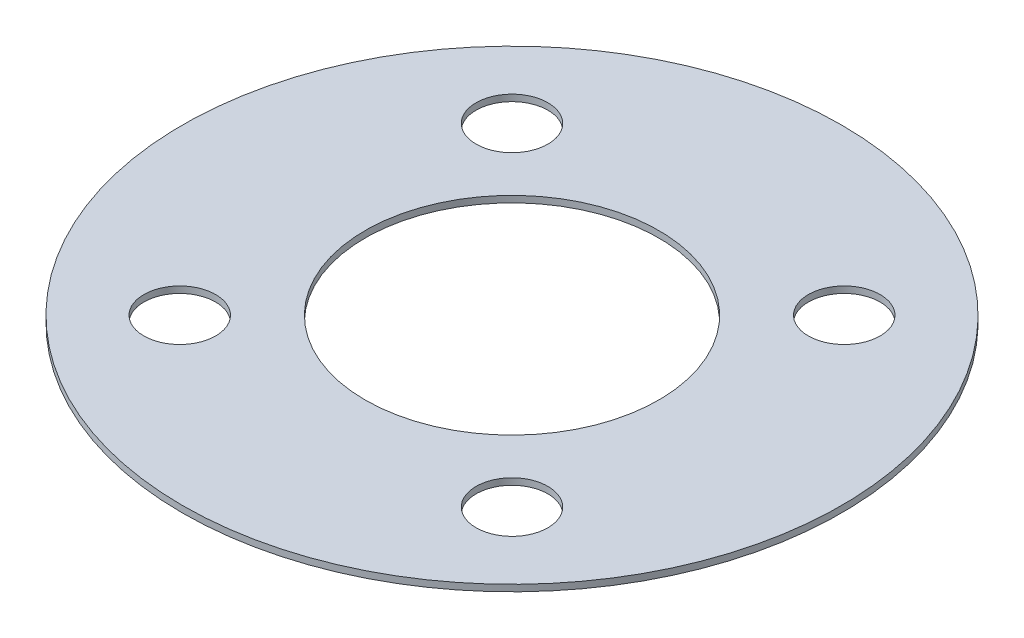
ISO-10303-21;
HEADER;
FILE_DESCRIPTION(('STEP AP214'),'2;1');
FILE_NAME('part.step','',(''),(''),'','','');
FILE_SCHEMA(('AUTOMOTIVE_DESIGN { 1 0 10303 214 1 1 1 1 }'));
ENDSEC;
DATA;
#1=APPLICATION_CONTEXT('core data for automotive mechanical design processes');
#2=APPLICATION_PROTOCOL_DEFINITION('international standard','automotive_design',2000,#1);
#3=PRODUCT_CONTEXT('',#1,'mechanical');
#4=PRODUCT('Part','Part','',(#3));
#5=PRODUCT_RELATED_PRODUCT_CATEGORY('part','',(#4));
#6=PRODUCT_DEFINITION_FORMATION('','',#4);
#7=PRODUCT_DEFINITION_CONTEXT('part definition',#1,'design');
#8=PRODUCT_DEFINITION('design','',#6,#7);
#9=PRODUCT_DEFINITION_SHAPE('','',#8);
#10=(LENGTH_UNIT() NAMED_UNIT(*) SI_UNIT(.MILLI.,.METRE.));
#11=(NAMED_UNIT(*) PLANE_ANGLE_UNIT() SI_UNIT($,.RADIAN.));
#12=(NAMED_UNIT(*) SI_UNIT($,.STERADIAN.) SOLID_ANGLE_UNIT());
#13=UNCERTAINTY_MEASURE_WITH_UNIT(LENGTH_MEASURE(1.E-05),#10,'distance_accuracy_value','');
#14=(GEOMETRIC_REPRESENTATION_CONTEXT(3) GLOBAL_UNCERTAINTY_ASSIGNED_CONTEXT((#13)) GLOBAL_UNIT_ASSIGNED_CONTEXT((#10,
#11,#12)) REPRESENTATION_CONTEXT('',''));
#15=CARTESIAN_POINT('',(0.,0.,0.));
#16=DIRECTION('',(0.,0.,1.));
#17=DIRECTION('',(1.,0.,0.));
#18=AXIS2_PLACEMENT_3D('',#15,#16,#17);
#19=CARTESIAN_POINT('',(0.,0.5,0.));
#20=DIRECTION('',(0.,-1.,0.));
#21=DIRECTION('',(0.,0.,-1.));
#22=AXIS2_PLACEMENT_3D('',#19,#20,#21);
#23=CYLINDRICAL_SURFACE('',#22,25.25);
#24=CARTESIAN_POINT('',(0.,0.5,0.));
#25=DIRECTION('',(0.,1.,0.));
#26=DIRECTION('',(0.,0.,1.));
#27=AXIS2_PLACEMENT_3D('',#24,#25,#26);
#28=CIRCLE('',#27,25.25);
#29=CARTESIAN_POINT('',(0.,0.5,25.25));
#30=VERTEX_POINT('',#29);
#31=EDGE_CURVE('E10',#30,#30,#28,.T.);
#32=ORIENTED_EDGE('',*,*,#31,.F.);
#33=EDGE_LOOP('',(#32));
#34=FACE_BOUND('',#33,.T.);
#35=CARTESIAN_POINT('',(0.,0.,0.));
#36=DIRECTION('',(0.,1.,0.));
#37=DIRECTION('',(0.,0.,1.));
#38=AXIS2_PLACEMENT_3D('',#35,#36,#37);
#39=CIRCLE('',#38,25.25);
#40=CARTESIAN_POINT('',(0.,0.,25.25));
#41=VERTEX_POINT('',#40);
#42=EDGE_CURVE('E41',#41,#41,#39,.T.);
#43=ORIENTED_EDGE('',*,*,#42,.T.);
#44=EDGE_LOOP('',(#43));
#45=FACE_BOUND('',#44,.T.);
#46=ADVANCED_FACE('F38',(#34,#45),#23,.T.);
#47=CARTESIAN_POINT('',(0.,0.5,0.));
#48=DIRECTION('',(0.,1.,0.));
#49=DIRECTION('',(0.,0.,1.));
#50=AXIS2_PLACEMENT_3D('',#47,#48,#49);
#51=PLANE('',#50);
#52=CARTESIAN_POINT('',(-12.7279220613579,0.5,-12.7279220613579));
#53=DIRECTION('',(0.,1.,0.));
#54=DIRECTION('',(0.,0.,1.));
#55=AXIS2_PLACEMENT_3D('',#52,#53,#54);
#56=CIRCLE('',#55,2.75);
#57=CARTESIAN_POINT('',(-12.7279220613579,0.5,-9.97792206135786));
#58=VERTEX_POINT('',#57);
#59=EDGE_CURVE('E76',#58,#58,#56,.T.);
#60=ORIENTED_EDGE('',*,*,#59,.F.);
#61=EDGE_LOOP('',(#60));
#62=FACE_BOUND('',#61,.T.);
#63=CARTESIAN_POINT('',(12.7279220613579,0.5,12.7279220613579));
#64=DIRECTION('',(0.,1.,0.));
#65=DIRECTION('',(0.,0.,1.));
#66=AXIS2_PLACEMENT_3D('',#63,#64,#65);
#67=CIRCLE('',#66,2.75);
#68=CARTESIAN_POINT('',(12.7279220613579,0.5,15.4779220613579));
#69=VERTEX_POINT('',#68);
#70=EDGE_CURVE('E70',#69,#69,#67,.T.);
#71=ORIENTED_EDGE('',*,*,#70,.F.);
#72=EDGE_LOOP('',(#71));
#73=FACE_BOUND('',#72,.T.);
#74=CARTESIAN_POINT('',(-12.7279220613579,0.5,12.7279220613579));
#75=DIRECTION('',(0.,1.,0.));
#76=DIRECTION('',(0.,0.,1.));
#77=AXIS2_PLACEMENT_3D('',#74,#75,#76);
#78=CIRCLE('',#77,2.75);
#79=CARTESIAN_POINT('',(-12.7279220613579,0.5,15.4779220613579));
#80=VERTEX_POINT('',#79);
#81=EDGE_CURVE('E64',#80,#80,#78,.T.);
#82=ORIENTED_EDGE('',*,*,#81,.F.);
#83=EDGE_LOOP('',(#82));
#84=FACE_BOUND('',#83,.T.);
#85=CARTESIAN_POINT('',(12.7279220613578,0.5,-12.7279220613579));
#86=DIRECTION('',(0.,1.,0.));
#87=DIRECTION('',(0.,0.,1.));
#88=AXIS2_PLACEMENT_3D('',#85,#86,#87);
#89=CIRCLE('',#88,2.75);
#90=CARTESIAN_POINT('',(12.7279220613578,0.5,-9.97792206135786));
#91=VERTEX_POINT('',#90);
#92=EDGE_CURVE('E58',#91,#91,#89,.T.);
#93=ORIENTED_EDGE('',*,*,#92,.F.);
#94=EDGE_LOOP('',(#93));
#95=FACE_BOUND('',#94,.T.);
#96=CARTESIAN_POINT('',(0.,0.5,0.));
#97=DIRECTION('',(0.,1.,0.));
#98=DIRECTION('',(0.,0.,1.));
#99=AXIS2_PLACEMENT_3D('',#96,#97,#98);
#100=CIRCLE('',#99,11.25);
#101=CARTESIAN_POINT('',(0.,0.5,11.25));
#102=VERTEX_POINT('',#101);
#103=EDGE_CURVE('E50',#102,#102,#100,.T.);
#104=ORIENTED_EDGE('',*,*,#103,.F.);
#105=EDGE_LOOP('',(#104));
#106=FACE_BOUND('',#105,.T.);
#107=ORIENTED_EDGE('',*,*,#31,.T.);
#108=EDGE_LOOP('',(#107));
#109=FACE_BOUND('',#108,.T.);
#110=ADVANCED_FACE('F82',(#62,#73,#84,#95,#106,#109),#51,.T.);
#111=CARTESIAN_POINT('',(0.,0.,0.));
#112=DIRECTION('',(0.,1.,0.));
#113=DIRECTION('',(0.,0.,1.));
#114=AXIS2_PLACEMENT_3D('',#111,#112,#113);
#115=PLANE('',#114);
#116=CARTESIAN_POINT('',(-12.7279220613579,0.,-12.7279220613579));
#117=DIRECTION('',(0.,1.,0.));
#118=DIRECTION('',(0.,0.,1.));
#119=AXIS2_PLACEMENT_3D('',#116,#117,#118);
#120=CIRCLE('',#119,2.75);
#121=CARTESIAN_POINT('',(-12.7279220613579,0.,-9.97792206135786));
#122=VERTEX_POINT('',#121);
#123=EDGE_CURVE('E73',#122,#122,#120,.T.);
#124=ORIENTED_EDGE('',*,*,#123,.T.);
#125=EDGE_LOOP('',(#124));
#126=FACE_BOUND('',#125,.T.);
#127=CARTESIAN_POINT('',(12.7279220613579,0.,12.7279220613579));
#128=DIRECTION('',(0.,1.,0.));
#129=DIRECTION('',(0.,0.,1.));
#130=AXIS2_PLACEMENT_3D('',#127,#128,#129);
#131=CIRCLE('',#130,2.75);
#132=CARTESIAN_POINT('',(12.7279220613579,0.,15.4779220613579));
#133=VERTEX_POINT('',#132);
#134=EDGE_CURVE('E67',#133,#133,#131,.T.);
#135=ORIENTED_EDGE('',*,*,#134,.T.);
#136=EDGE_LOOP('',(#135));
#137=FACE_BOUND('',#136,.T.);
#138=CARTESIAN_POINT('',(-12.7279220613579,0.,12.7279220613579));
#139=DIRECTION('',(0.,1.,0.));
#140=DIRECTION('',(0.,0.,1.));
#141=AXIS2_PLACEMENT_3D('',#138,#139,#140);
#142=CIRCLE('',#141,2.75);
#143=CARTESIAN_POINT('',(-12.7279220613579,0.,15.4779220613579));
#144=VERTEX_POINT('',#143);
#145=EDGE_CURVE('E61',#144,#144,#142,.T.);
#146=ORIENTED_EDGE('',*,*,#145,.T.);
#147=EDGE_LOOP('',(#146));
#148=FACE_BOUND('',#147,.T.);
#149=CARTESIAN_POINT('',(12.7279220613578,0.,-12.7279220613579));
#150=DIRECTION('',(0.,1.,0.));
#151=DIRECTION('',(0.,0.,1.));
#152=AXIS2_PLACEMENT_3D('',#149,#150,#151);
#153=CIRCLE('',#152,2.75);
#154=CARTESIAN_POINT('',(12.7279220613578,0.,-9.97792206135786));
#155=VERTEX_POINT('',#154);
#156=EDGE_CURVE('E53',#155,#155,#153,.T.);
#157=ORIENTED_EDGE('',*,*,#156,.T.);
#158=EDGE_LOOP('',(#157));
#159=FACE_BOUND('',#158,.T.);
#160=CARTESIAN_POINT('',(0.,0.,0.));
#161=DIRECTION('',(0.,1.,0.));
#162=DIRECTION('',(0.,0.,1.));
#163=AXIS2_PLACEMENT_3D('',#160,#161,#162);
#164=CIRCLE('',#163,11.25);
#165=CARTESIAN_POINT('',(0.,0.,11.25));
#166=VERTEX_POINT('',#165);
#167=EDGE_CURVE('E48',#166,#166,#164,.T.);
#168=ORIENTED_EDGE('',*,*,#167,.T.);
#169=EDGE_LOOP('',(#168));
#170=FACE_BOUND('',#169,.T.);
#171=ORIENTED_EDGE('',*,*,#42,.F.);
#172=EDGE_LOOP('',(#171));
#173=FACE_BOUND('',#172,.T.);
#174=ADVANCED_FACE('F85',(#126,#137,#148,#159,#170,#173),#115,.F.);
#175=CARTESIAN_POINT('',(0.,0.,0.));
#176=DIRECTION('',(0.,1.,0.));
#177=DIRECTION('',(0.,0.,1.));
#178=AXIS2_PLACEMENT_3D('',#175,#176,#177);
#179=CYLINDRICAL_SURFACE('',#178,11.25);
#180=ORIENTED_EDGE('',*,*,#167,.F.);
#181=EDGE_LOOP('',(#180));
#182=FACE_BOUND('',#181,.T.);
#183=ORIENTED_EDGE('',*,*,#103,.T.);
#184=EDGE_LOOP('',(#183));
#185=FACE_BOUND('',#184,.T.);
#186=ADVANCED_FACE('F95',(#182,#185),#179,.F.);
#187=CARTESIAN_POINT('',(12.7279220613578,0.5,-12.7279220613579));
#188=DIRECTION('',(0.,1.,0.));
#189=DIRECTION('',(0.,0.,1.));
#190=AXIS2_PLACEMENT_3D('',#187,#188,#189);
#191=CYLINDRICAL_SURFACE('',#190,2.75);
#192=ORIENTED_EDGE('',*,*,#156,.F.);
#193=EDGE_LOOP('',(#192));
#194=FACE_BOUND('',#193,.T.);
#195=ORIENTED_EDGE('',*,*,#92,.T.);
#196=EDGE_LOOP('',(#195));
#197=FACE_BOUND('',#196,.T.);
#198=ADVANCED_FACE('F97',(#194,#197),#191,.F.);
#199=CARTESIAN_POINT('',(-12.7279220613579,0.5,12.7279220613579));
#200=DIRECTION('',(0.,1.,0.));
#201=DIRECTION('',(0.,0.,1.));
#202=AXIS2_PLACEMENT_3D('',#199,#200,#201);
#203=CYLINDRICAL_SURFACE('',#202,2.75);
#204=ORIENTED_EDGE('',*,*,#145,.F.);
#205=EDGE_LOOP('',(#204));
#206=FACE_BOUND('',#205,.T.);
#207=ORIENTED_EDGE('',*,*,#81,.T.);
#208=EDGE_LOOP('',(#207));
#209=FACE_BOUND('',#208,.T.);
#210=ADVANCED_FACE('F104',(#206,#209),#203,.F.);
#211=CARTESIAN_POINT('',(12.7279220613579,0.5,12.7279220613579));
#212=DIRECTION('',(0.,1.,0.));
#213=DIRECTION('',(0.,0.,1.));
#214=AXIS2_PLACEMENT_3D('',#211,#212,#213);
#215=CYLINDRICAL_SURFACE('',#214,2.75);
#216=ORIENTED_EDGE('',*,*,#134,.F.);
#217=EDGE_LOOP('',(#216));
#218=FACE_BOUND('',#217,.T.);
#219=ORIENTED_EDGE('',*,*,#70,.T.);
#220=EDGE_LOOP('',(#219));
#221=FACE_BOUND('',#220,.T.);
#222=ADVANCED_FACE('F148',(#218,#221),#215,.F.);
#223=CARTESIAN_POINT('',(-12.7279220613579,0.5,-12.7279220613579));
#224=DIRECTION('',(0.,1.,0.));
#225=DIRECTION('',(0.,0.,1.));
#226=AXIS2_PLACEMENT_3D('',#223,#224,#225);
#227=CYLINDRICAL_SURFACE('',#226,2.75);
#228=ORIENTED_EDGE('',*,*,#123,.F.);
#229=EDGE_LOOP('',(#228));
#230=FACE_BOUND('',#229,.T.);
#231=ORIENTED_EDGE('',*,*,#59,.T.);
#232=EDGE_LOOP('',(#231));
#233=FACE_BOUND('',#232,.T.);
#234=ADVANCED_FACE('F80',(#230,#233),#227,.F.);
#235=CLOSED_SHELL('',(#46,#110,#174,#186,#198,#210,#222,#234));
#236=MANIFOLD_SOLID_BREP('B2',#235);
#237=ADVANCED_BREP_SHAPE_REPRESENTATION('',(#18,#236),#14);
#238=SHAPE_DEFINITION_REPRESENTATION(#9,#237);
ENDSEC;
END-ISO-10303-21;
